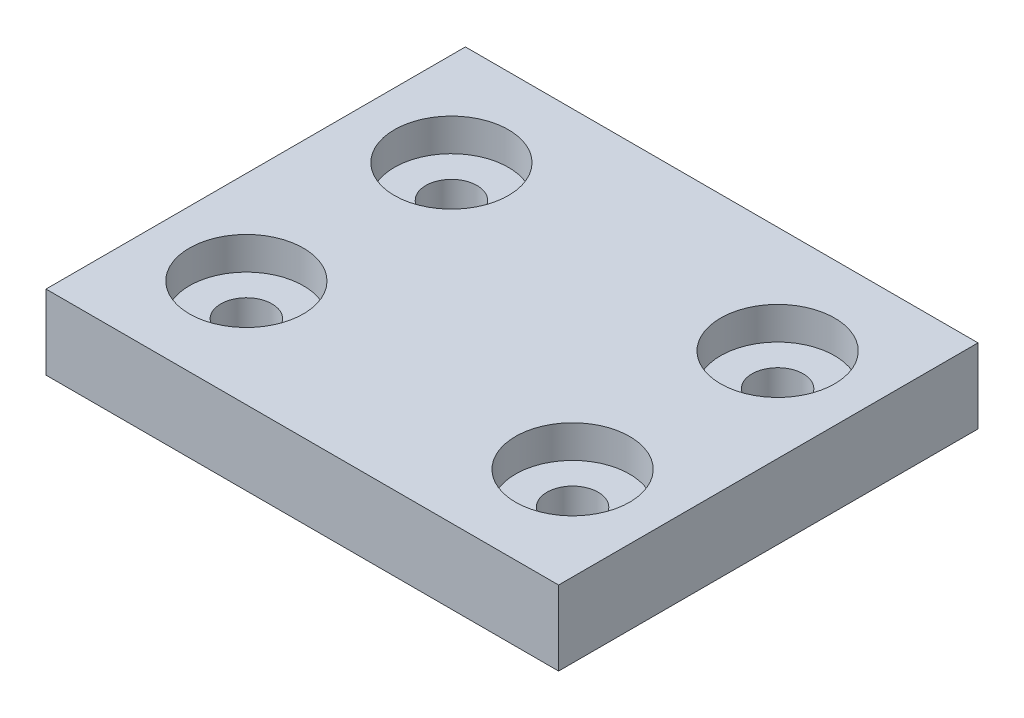
ISO-10303-21;
HEADER;
FILE_DESCRIPTION(('STEP AP214'),'2;1');
FILE_NAME('part.step','',(''),(''),'','','');
FILE_SCHEMA(('AUTOMOTIVE_DESIGN { 1 0 10303 214 1 1 1 1 }'));
ENDSEC;
DATA;
#1=APPLICATION_CONTEXT('core data for automotive mechanical design processes');
#2=APPLICATION_PROTOCOL_DEFINITION('international standard','automotive_design',2000,#1);
#3=PRODUCT_CONTEXT('',#1,'mechanical');
#4=PRODUCT('Part','Part','',(#3));
#5=PRODUCT_RELATED_PRODUCT_CATEGORY('part','',(#4));
#6=PRODUCT_DEFINITION_FORMATION('','',#4);
#7=PRODUCT_DEFINITION_CONTEXT('part definition',#1,'design');
#8=PRODUCT_DEFINITION('design','',#6,#7);
#9=PRODUCT_DEFINITION_SHAPE('','',#8);
#10=(LENGTH_UNIT() NAMED_UNIT(*) SI_UNIT(.MILLI.,.METRE.));
#11=(NAMED_UNIT(*) PLANE_ANGLE_UNIT() SI_UNIT($,.RADIAN.));
#12=(NAMED_UNIT(*) SI_UNIT($,.STERADIAN.) SOLID_ANGLE_UNIT());
#13=UNCERTAINTY_MEASURE_WITH_UNIT(LENGTH_MEASURE(1.E-05),#10,'distance_accuracy_value','');
#14=(GEOMETRIC_REPRESENTATION_CONTEXT(3) GLOBAL_UNCERTAINTY_ASSIGNED_CONTEXT((#13)) GLOBAL_UNIT_ASSIGNED_CONTEXT((#10,
#11,#12)) REPRESENTATION_CONTEXT('',''));
#15=CARTESIAN_POINT('',(0.,0.,0.));
#16=DIRECTION('',(0.,0.,1.));
#17=DIRECTION('',(1.,0.,0.));
#18=AXIS2_PLACEMENT_3D('',#15,#16,#17);
#19=CARTESIAN_POINT('',(27.5,8.,-22.5));
#20=DIRECTION('',(-1.,0.,0.));
#21=DIRECTION('',(0.,0.,1.));
#22=AXIS2_PLACEMENT_3D('',#19,#20,#21);
#23=PLANE('',#22);
#24=DIRECTION('',(0.,0.,-1.));
#25=VECTOR('',#24,1.);
#26=CARTESIAN_POINT('',(27.5,0.,-22.5));
#27=LINE('',#26,#25);
#28=CARTESIAN_POINT('',(27.5,0.,22.5));
#29=VERTEX_POINT('',#28);
#30=CARTESIAN_POINT('',(27.5,0.,-22.5));
#31=VERTEX_POINT('',#30);
#32=EDGE_CURVE('E107',#29,#31,#27,.T.);
#33=ORIENTED_EDGE('',*,*,#32,.T.);
#34=DIRECTION('',(0.,-1.,0.));
#35=VECTOR('',#34,1.);
#36=CARTESIAN_POINT('',(27.5,8.,-22.5));
#37=LINE('',#36,#35);
#38=CARTESIAN_POINT('',(27.5,8.,-22.5));
#39=VERTEX_POINT('',#38);
#40=EDGE_CURVE('E11',#39,#31,#37,.T.);
#41=ORIENTED_EDGE('',*,*,#40,.F.);
#42=DIRECTION('',(0.,0.,-1.));
#43=VECTOR('',#42,1.);
#44=CARTESIAN_POINT('',(27.5,8.,-22.5));
#45=LINE('',#44,#43);
#46=CARTESIAN_POINT('',(27.5,8.,22.5));
#47=VERTEX_POINT('',#46);
#48=EDGE_CURVE('E91',#47,#39,#45,.T.);
#49=ORIENTED_EDGE('',*,*,#48,.F.);
#50=DIRECTION('',(0.,-1.,0.));
#51=VECTOR('',#50,1.);
#52=CARTESIAN_POINT('',(27.5,8.,22.5));
#53=LINE('',#52,#51);
#54=EDGE_CURVE('E103',#47,#29,#53,.T.);
#55=ORIENTED_EDGE('',*,*,#54,.T.);
#56=EDGE_LOOP('',(#33,#41,#49,#55));
#57=FACE_BOUND('',#56,.T.);
#58=ADVANCED_FACE('F39',(#57),#23,.F.);
#59=CARTESIAN_POINT('',(-27.5,8.,-22.5));
#60=DIRECTION('',(0.,0.,1.));
#61=DIRECTION('',(1.,0.,0.));
#62=AXIS2_PLACEMENT_3D('',#59,#60,#61);
#63=PLANE('',#62);
#64=DIRECTION('',(-1.,0.,0.));
#65=VECTOR('',#64,1.);
#66=CARTESIAN_POINT('',(-27.5,0.,-22.5));
#67=LINE('',#66,#65);
#68=CARTESIAN_POINT('',(-27.5,0.,-22.5));
#69=VERTEX_POINT('',#68);
#70=EDGE_CURVE('E96',#31,#69,#67,.T.);
#71=ORIENTED_EDGE('',*,*,#70,.T.);
#72=DIRECTION('',(0.,-1.,0.));
#73=VECTOR('',#72,1.);
#74=CARTESIAN_POINT('',(-27.5,8.,-22.5));
#75=LINE('',#74,#73);
#76=CARTESIAN_POINT('',(-27.5,8.,-22.5));
#77=VERTEX_POINT('',#76);
#78=EDGE_CURVE('E48',#77,#69,#75,.T.);
#79=ORIENTED_EDGE('',*,*,#78,.F.);
#80=DIRECTION('',(-1.,0.,0.));
#81=VECTOR('',#80,1.);
#82=CARTESIAN_POINT('',(-27.5,8.,-22.5));
#83=LINE('',#82,#81);
#84=EDGE_CURVE('E86',#39,#77,#83,.T.);
#85=ORIENTED_EDGE('',*,*,#84,.F.);
#86=ORIENTED_EDGE('',*,*,#40,.T.);
#87=EDGE_LOOP('',(#71,#79,#85,#86));
#88=FACE_BOUND('',#87,.T.);
#89=ADVANCED_FACE('F95',(#88),#63,.F.);
#90=CARTESIAN_POINT('',(-27.5,8.,-22.5));
#91=DIRECTION('',(1.,0.,0.));
#92=DIRECTION('',(0.,0.,-1.));
#93=AXIS2_PLACEMENT_3D('',#90,#91,#92);
#94=PLANE('',#93);
#95=DIRECTION('',(0.,0.,1.));
#96=VECTOR('',#95,1.);
#97=CARTESIAN_POINT('',(-27.5,0.,-22.5));
#98=LINE('',#97,#96);
#99=CARTESIAN_POINT('',(-27.5,0.,22.5));
#100=VERTEX_POINT('',#99);
#101=EDGE_CURVE('E73',#69,#100,#98,.T.);
#102=ORIENTED_EDGE('',*,*,#101,.T.);
#103=DIRECTION('',(0.,-1.,0.));
#104=VECTOR('',#103,1.);
#105=CARTESIAN_POINT('',(-27.5,8.,22.5));
#106=LINE('',#105,#104);
#107=CARTESIAN_POINT('',(-27.5,8.,22.5));
#108=VERTEX_POINT('',#107);
#109=EDGE_CURVE('E98',#108,#100,#106,.T.);
#110=ORIENTED_EDGE('',*,*,#109,.F.);
#111=DIRECTION('',(0.,0.,1.));
#112=VECTOR('',#111,1.);
#113=CARTESIAN_POINT('',(-27.5,8.,-22.5));
#114=LINE('',#113,#112);
#115=EDGE_CURVE('E89',#77,#108,#114,.T.);
#116=ORIENTED_EDGE('',*,*,#115,.F.);
#117=ORIENTED_EDGE('',*,*,#78,.T.);
#118=EDGE_LOOP('',(#102,#110,#116,#117));
#119=FACE_BOUND('',#118,.T.);
#120=ADVANCED_FACE('F99',(#119),#94,.F.);
#121=CARTESIAN_POINT('',(-27.5,8.,22.5));
#122=DIRECTION('',(0.,0.,-1.));
#123=DIRECTION('',(-1.,0.,0.));
#124=AXIS2_PLACEMENT_3D('',#121,#122,#123);
#125=PLANE('',#124);
#126=DIRECTION('',(1.,0.,0.));
#127=VECTOR('',#126,1.);
#128=CARTESIAN_POINT('',(-27.5,0.,22.5));
#129=LINE('',#128,#127);
#130=EDGE_CURVE('E79',#100,#29,#129,.T.);
#131=ORIENTED_EDGE('',*,*,#130,.T.);
#132=ORIENTED_EDGE('',*,*,#54,.F.);
#133=DIRECTION('',(1.,0.,0.));
#134=VECTOR('',#133,1.);
#135=CARTESIAN_POINT('',(-27.5,8.,22.5));
#136=LINE('',#135,#134);
#137=EDGE_CURVE('E56',#108,#47,#136,.T.);
#138=ORIENTED_EDGE('',*,*,#137,.F.);
#139=ORIENTED_EDGE('',*,*,#109,.T.);
#140=EDGE_LOOP('',(#131,#132,#138,#139));
#141=FACE_BOUND('',#140,.T.);
#142=ADVANCED_FACE('F121',(#141),#125,.F.);
#143=CARTESIAN_POINT('',(0.,8.,0.));
#144=DIRECTION('',(0.,1.,0.));
#145=DIRECTION('',(0.,0.,1.));
#146=AXIS2_PLACEMENT_3D('',#143,#144,#145);
#147=PLANE('',#146);
#148=CARTESIAN_POINT('',(-17.5,8.,-11.));
#149=DIRECTION('',(0.,1.,0.));
#150=DIRECTION('',(0.,0.,1.));
#151=AXIS2_PLACEMENT_3D('',#148,#149,#150);
#152=CIRCLE('',#151,6.119);
#153=CARTESIAN_POINT('',(-17.5,8.,-4.881));
#154=VERTEX_POINT('',#153);
#155=EDGE_CURVE('E187',#154,#154,#152,.T.);
#156=ORIENTED_EDGE('',*,*,#155,.F.);
#157=EDGE_LOOP('',(#156));
#158=FACE_BOUND('',#157,.T.);
#159=CARTESIAN_POINT('',(17.5,8.,-11.));
#160=DIRECTION('',(0.,1.,0.));
#161=DIRECTION('',(0.,0.,1.));
#162=AXIS2_PLACEMENT_3D('',#159,#160,#161);
#163=CIRCLE('',#162,6.119);
#164=CARTESIAN_POINT('',(17.5,8.,-4.881));
#165=VERTEX_POINT('',#164);
#166=EDGE_CURVE('E171',#165,#165,#163,.T.);
#167=ORIENTED_EDGE('',*,*,#166,.F.);
#168=EDGE_LOOP('',(#167));
#169=FACE_BOUND('',#168,.T.);
#170=CARTESIAN_POINT('',(17.5,8.,11.));
#171=DIRECTION('',(0.,1.,0.));
#172=DIRECTION('',(0.,0.,1.));
#173=AXIS2_PLACEMENT_3D('',#170,#171,#172);
#174=CIRCLE('',#173,6.119);
#175=CARTESIAN_POINT('',(17.5,8.,17.119));
#176=VERTEX_POINT('',#175);
#177=EDGE_CURVE('E155',#176,#176,#174,.T.);
#178=ORIENTED_EDGE('',*,*,#177,.F.);
#179=EDGE_LOOP('',(#178));
#180=FACE_BOUND('',#179,.T.);
#181=CARTESIAN_POINT('',(-17.5,8.,11.));
#182=DIRECTION('',(0.,1.,0.));
#183=DIRECTION('',(0.,0.,1.));
#184=AXIS2_PLACEMENT_3D('',#181,#182,#183);
#185=CIRCLE('',#184,6.119);
#186=CARTESIAN_POINT('',(-17.5,8.,17.119));
#187=VERTEX_POINT('',#186);
#188=EDGE_CURVE('E139',#187,#187,#185,.T.);
#189=ORIENTED_EDGE('',*,*,#188,.F.);
#190=EDGE_LOOP('',(#189));
#191=FACE_BOUND('',#190,.T.);
#192=ORIENTED_EDGE('',*,*,#48,.T.);
#193=ORIENTED_EDGE('',*,*,#84,.T.);
#194=ORIENTED_EDGE('',*,*,#115,.T.);
#195=ORIENTED_EDGE('',*,*,#137,.T.);
#196=EDGE_LOOP('',(#192,#193,#194,#195));
#197=FACE_BOUND('',#196,.T.);
#198=ADVANCED_FACE('F87',(#158,#169,#180,#191,#197),#147,.T.);
#199=CARTESIAN_POINT('',(0.,0.,0.));
#200=DIRECTION('',(0.,1.,0.));
#201=DIRECTION('',(0.,0.,1.));
#202=AXIS2_PLACEMENT_3D('',#199,#200,#201);
#203=PLANE('',#202);
#204=CARTESIAN_POINT('',(-17.5,0.,-11.));
#205=DIRECTION('',(0.,1.,0.));
#206=DIRECTION('',(0.,0.,1.));
#207=AXIS2_PLACEMENT_3D('',#204,#205,#206);
#208=CIRCLE('',#207,2.75);
#209=CARTESIAN_POINT('',(-17.5,0.,-8.25));
#210=VERTEX_POINT('',#209);
#211=EDGE_CURVE('E175',#210,#210,#208,.T.);
#212=ORIENTED_EDGE('',*,*,#211,.T.);
#213=EDGE_LOOP('',(#212));
#214=FACE_BOUND('',#213,.T.);
#215=CARTESIAN_POINT('',(17.5,0.,-11.));
#216=DIRECTION('',(0.,1.,0.));
#217=DIRECTION('',(0.,0.,1.));
#218=AXIS2_PLACEMENT_3D('',#215,#216,#217);
#219=CIRCLE('',#218,2.75);
#220=CARTESIAN_POINT('',(17.5,0.,-8.25));
#221=VERTEX_POINT('',#220);
#222=EDGE_CURVE('E159',#221,#221,#219,.T.);
#223=ORIENTED_EDGE('',*,*,#222,.T.);
#224=EDGE_LOOP('',(#223));
#225=FACE_BOUND('',#224,.T.);
#226=CARTESIAN_POINT('',(17.5,0.,11.));
#227=DIRECTION('',(0.,1.,0.));
#228=DIRECTION('',(0.,0.,1.));
#229=AXIS2_PLACEMENT_3D('',#226,#227,#228);
#230=CIRCLE('',#229,2.75);
#231=CARTESIAN_POINT('',(17.5,0.,13.75));
#232=VERTEX_POINT('',#231);
#233=EDGE_CURVE('E143',#232,#232,#230,.T.);
#234=ORIENTED_EDGE('',*,*,#233,.T.);
#235=EDGE_LOOP('',(#234));
#236=FACE_BOUND('',#235,.T.);
#237=CARTESIAN_POINT('',(-17.5,0.,11.));
#238=DIRECTION('',(0.,1.,0.));
#239=DIRECTION('',(0.,0.,1.));
#240=AXIS2_PLACEMENT_3D('',#237,#238,#239);
#241=CIRCLE('',#240,2.75);
#242=CARTESIAN_POINT('',(-17.5,0.,13.75));
#243=VERTEX_POINT('',#242);
#244=EDGE_CURVE('E111',#243,#243,#241,.T.);
#245=ORIENTED_EDGE('',*,*,#244,.T.);
#246=EDGE_LOOP('',(#245));
#247=FACE_BOUND('',#246,.T.);
#248=ORIENTED_EDGE('',*,*,#32,.F.);
#249=ORIENTED_EDGE('',*,*,#130,.F.);
#250=ORIENTED_EDGE('',*,*,#101,.F.);
#251=ORIENTED_EDGE('',*,*,#70,.F.);
#252=EDGE_LOOP('',(#248,#249,#250,#251));
#253=FACE_BOUND('',#252,.T.);
#254=ADVANCED_FACE('F124',(#214,#225,#236,#247,#253),#203,.F.);
#255=CARTESIAN_POINT('',(-17.5,8.,11.));
#256=DIRECTION('',(0.,1.,0.));
#257=DIRECTION('',(0.,0.,1.));
#258=AXIS2_PLACEMENT_3D('',#255,#256,#257);
#259=CYLINDRICAL_SURFACE('',#258,2.75);
#260=ORIENTED_EDGE('',*,*,#244,.F.);
#261=EDGE_LOOP('',(#260));
#262=FACE_BOUND('',#261,.T.);
#263=CARTESIAN_POINT('',(-17.5,4.5,11.));
#264=DIRECTION('',(0.,1.,0.));
#265=DIRECTION('',(0.,0.,1.));
#266=AXIS2_PLACEMENT_3D('',#263,#264,#265);
#267=CIRCLE('',#266,2.75);
#268=CARTESIAN_POINT('',(-17.5,4.5,13.75));
#269=VERTEX_POINT('',#268);
#270=EDGE_CURVE('E131',#269,#269,#267,.T.);
#271=ORIENTED_EDGE('',*,*,#270,.T.);
#272=EDGE_LOOP('',(#271));
#273=FACE_BOUND('',#272,.T.);
#274=ADVANCED_FACE('F216',(#262,#273),#259,.F.);
#275=CARTESIAN_POINT('',(-14.75,4.5,11.));
#276=DIRECTION('',(0.,-1.,0.));
#277=DIRECTION('',(0.,0.,-1.));
#278=AXIS2_PLACEMENT_3D('',#275,#276,#277);
#279=PLANE('',#278);
#280=ORIENTED_EDGE('',*,*,#270,.F.);
#281=EDGE_LOOP('',(#280));
#282=FACE_BOUND('',#281,.T.);
#283=CARTESIAN_POINT('',(-17.5,4.5,11.));
#284=DIRECTION('',(0.,1.,0.));
#285=DIRECTION('',(0.,0.,1.));
#286=AXIS2_PLACEMENT_3D('',#283,#284,#285);
#287=CIRCLE('',#286,6.119);
#288=CARTESIAN_POINT('',(-17.5,4.5,17.119));
#289=VERTEX_POINT('',#288);
#290=EDGE_CURVE('E135',#289,#289,#287,.T.);
#291=ORIENTED_EDGE('',*,*,#290,.T.);
#292=EDGE_LOOP('',(#291));
#293=FACE_BOUND('',#292,.T.);
#294=ADVANCED_FACE('F206',(#282,#293),#279,.F.);
#295=CARTESIAN_POINT('',(-17.5,8.,11.));
#296=DIRECTION('',(0.,1.,0.));
#297=DIRECTION('',(0.,0.,1.));
#298=AXIS2_PLACEMENT_3D('',#295,#296,#297);
#299=CYLINDRICAL_SURFACE('',#298,6.119);
#300=ORIENTED_EDGE('',*,*,#290,.F.);
#301=EDGE_LOOP('',(#300));
#302=FACE_BOUND('',#301,.T.);
#303=ORIENTED_EDGE('',*,*,#188,.T.);
#304=EDGE_LOOP('',(#303));
#305=FACE_BOUND('',#304,.T.);
#306=ADVANCED_FACE('F203',(#302,#305),#299,.F.);
#307=CARTESIAN_POINT('',(17.5,8.,11.));
#308=DIRECTION('',(0.,1.,0.));
#309=DIRECTION('',(0.,0.,1.));
#310=AXIS2_PLACEMENT_3D('',#307,#308,#309);
#311=CYLINDRICAL_SURFACE('',#310,2.75);
#312=ORIENTED_EDGE('',*,*,#233,.F.);
#313=EDGE_LOOP('',(#312));
#314=FACE_BOUND('',#313,.T.);
#315=CARTESIAN_POINT('',(17.5,4.5,11.));
#316=DIRECTION('',(0.,1.,0.));
#317=DIRECTION('',(0.,0.,1.));
#318=AXIS2_PLACEMENT_3D('',#315,#316,#317);
#319=CIRCLE('',#318,2.75);
#320=CARTESIAN_POINT('',(17.5,4.5,13.75));
#321=VERTEX_POINT('',#320);
#322=EDGE_CURVE('E147',#321,#321,#319,.T.);
#323=ORIENTED_EDGE('',*,*,#322,.T.);
#324=EDGE_LOOP('',(#323));
#325=FACE_BOUND('',#324,.T.);
#326=ADVANCED_FACE('F205',(#314,#325),#311,.F.);
#327=CARTESIAN_POINT('',(20.25,4.5,11.));
#328=DIRECTION('',(0.,-1.,0.));
#329=DIRECTION('',(0.,0.,-1.));
#330=AXIS2_PLACEMENT_3D('',#327,#328,#329);
#331=PLANE('',#330);
#332=ORIENTED_EDGE('',*,*,#322,.F.);
#333=EDGE_LOOP('',(#332));
#334=FACE_BOUND('',#333,.T.);
#335=CARTESIAN_POINT('',(17.5,4.5,11.));
#336=DIRECTION('',(0.,1.,0.));
#337=DIRECTION('',(0.,0.,1.));
#338=AXIS2_PLACEMENT_3D('',#335,#336,#337);
#339=CIRCLE('',#338,6.119);
#340=CARTESIAN_POINT('',(17.5,4.5,17.119));
#341=VERTEX_POINT('',#340);
#342=EDGE_CURVE('E151',#341,#341,#339,.T.);
#343=ORIENTED_EDGE('',*,*,#342,.T.);
#344=EDGE_LOOP('',(#343));
#345=FACE_BOUND('',#344,.T.);
#346=ADVANCED_FACE('F213',(#334,#345),#331,.F.);
#347=CARTESIAN_POINT('',(17.5,8.,11.));
#348=DIRECTION('',(0.,1.,0.));
#349=DIRECTION('',(0.,0.,1.));
#350=AXIS2_PLACEMENT_3D('',#347,#348,#349);
#351=CYLINDRICAL_SURFACE('',#350,6.119);
#352=ORIENTED_EDGE('',*,*,#342,.F.);
#353=EDGE_LOOP('',(#352));
#354=FACE_BOUND('',#353,.T.);
#355=ORIENTED_EDGE('',*,*,#177,.T.);
#356=EDGE_LOOP('',(#355));
#357=FACE_BOUND('',#356,.T.);
#358=ADVANCED_FACE('F268',(#354,#357),#351,.F.);
#359=CARTESIAN_POINT('',(17.5,8.,-11.));
#360=DIRECTION('',(0.,1.,0.));
#361=DIRECTION('',(0.,0.,1.));
#362=AXIS2_PLACEMENT_3D('',#359,#360,#361);
#363=CYLINDRICAL_SURFACE('',#362,2.75);
#364=ORIENTED_EDGE('',*,*,#222,.F.);
#365=EDGE_LOOP('',(#364));
#366=FACE_BOUND('',#365,.T.);
#367=CARTESIAN_POINT('',(17.5,4.5,-11.));
#368=DIRECTION('',(0.,1.,0.));
#369=DIRECTION('',(0.,0.,1.));
#370=AXIS2_PLACEMENT_3D('',#367,#368,#369);
#371=CIRCLE('',#370,2.75);
#372=CARTESIAN_POINT('',(17.5,4.5,-8.25));
#373=VERTEX_POINT('',#372);
#374=EDGE_CURVE('E163',#373,#373,#371,.T.);
#375=ORIENTED_EDGE('',*,*,#374,.T.);
#376=EDGE_LOOP('',(#375));
#377=FACE_BOUND('',#376,.T.);
#378=ADVANCED_FACE('F278',(#366,#377),#363,.F.);
#379=CARTESIAN_POINT('',(20.25,4.5,-11.));
#380=DIRECTION('',(0.,-1.,0.));
#381=DIRECTION('',(0.,0.,-1.));
#382=AXIS2_PLACEMENT_3D('',#379,#380,#381);
#383=PLANE('',#382);
#384=ORIENTED_EDGE('',*,*,#374,.F.);
#385=EDGE_LOOP('',(#384));
#386=FACE_BOUND('',#385,.T.);
#387=CARTESIAN_POINT('',(17.5,4.5,-11.));
#388=DIRECTION('',(0.,1.,0.));
#389=DIRECTION('',(0.,0.,1.));
#390=AXIS2_PLACEMENT_3D('',#387,#388,#389);
#391=CIRCLE('',#390,6.119);
#392=CARTESIAN_POINT('',(17.5,4.5,-4.881));
#393=VERTEX_POINT('',#392);
#394=EDGE_CURVE('E167',#393,#393,#391,.T.);
#395=ORIENTED_EDGE('',*,*,#394,.T.);
#396=EDGE_LOOP('',(#395));
#397=FACE_BOUND('',#396,.T.);
#398=ADVANCED_FACE('F288',(#386,#397),#383,.F.);
#399=CARTESIAN_POINT('',(17.5,8.,-11.));
#400=DIRECTION('',(0.,1.,0.));
#401=DIRECTION('',(0.,0.,1.));
#402=AXIS2_PLACEMENT_3D('',#399,#400,#401);
#403=CYLINDRICAL_SURFACE('',#402,6.119);
#404=ORIENTED_EDGE('',*,*,#394,.F.);
#405=EDGE_LOOP('',(#404));
#406=FACE_BOUND('',#405,.T.);
#407=ORIENTED_EDGE('',*,*,#166,.T.);
#408=EDGE_LOOP('',(#407));
#409=FACE_BOUND('',#408,.T.);
#410=ADVANCED_FACE('F298',(#406,#409),#403,.F.);
#411=CARTESIAN_POINT('',(-17.5,8.,-11.));
#412=DIRECTION('',(0.,1.,0.));
#413=DIRECTION('',(0.,0.,1.));
#414=AXIS2_PLACEMENT_3D('',#411,#412,#413);
#415=CYLINDRICAL_SURFACE('',#414,2.75);
#416=ORIENTED_EDGE('',*,*,#211,.F.);
#417=EDGE_LOOP('',(#416));
#418=FACE_BOUND('',#417,.T.);
#419=CARTESIAN_POINT('',(-17.5,4.5,-11.));
#420=DIRECTION('',(0.,1.,0.));
#421=DIRECTION('',(0.,0.,1.));
#422=AXIS2_PLACEMENT_3D('',#419,#420,#421);
#423=CIRCLE('',#422,2.75);
#424=CARTESIAN_POINT('',(-17.5,4.5,-8.25));
#425=VERTEX_POINT('',#424);
#426=EDGE_CURVE('E179',#425,#425,#423,.T.);
#427=ORIENTED_EDGE('',*,*,#426,.T.);
#428=EDGE_LOOP('',(#427));
#429=FACE_BOUND('',#428,.T.);
#430=ADVANCED_FACE('F308',(#418,#429),#415,.F.);
#431=CARTESIAN_POINT('',(-14.75,4.5,-11.));
#432=DIRECTION('',(0.,-1.,0.));
#433=DIRECTION('',(0.,0.,-1.));
#434=AXIS2_PLACEMENT_3D('',#431,#432,#433);
#435=PLANE('',#434);
#436=ORIENTED_EDGE('',*,*,#426,.F.);
#437=EDGE_LOOP('',(#436));
#438=FACE_BOUND('',#437,.T.);
#439=CARTESIAN_POINT('',(-17.5,4.5,-11.));
#440=DIRECTION('',(0.,1.,0.));
#441=DIRECTION('',(0.,0.,1.));
#442=AXIS2_PLACEMENT_3D('',#439,#440,#441);
#443=CIRCLE('',#442,6.119);
#444=CARTESIAN_POINT('',(-17.5,4.5,-4.881));
#445=VERTEX_POINT('',#444);
#446=EDGE_CURVE('E183',#445,#445,#443,.T.);
#447=ORIENTED_EDGE('',*,*,#446,.T.);
#448=EDGE_LOOP('',(#447));
#449=FACE_BOUND('',#448,.T.);
#450=ADVANCED_FACE('F318',(#438,#449),#435,.F.);
#451=CARTESIAN_POINT('',(-17.5,8.,-11.));
#452=DIRECTION('',(0.,1.,0.));
#453=DIRECTION('',(0.,0.,1.));
#454=AXIS2_PLACEMENT_3D('',#451,#452,#453);
#455=CYLINDRICAL_SURFACE('',#454,6.119);
#456=ORIENTED_EDGE('',*,*,#446,.F.);
#457=EDGE_LOOP('',(#456));
#458=FACE_BOUND('',#457,.T.);
#459=ORIENTED_EDGE('',*,*,#155,.T.);
#460=EDGE_LOOP('',(#459));
#461=FACE_BOUND('',#460,.T.);
#462=ADVANCED_FACE('F192',(#458,#461),#455,.F.);
#463=CLOSED_SHELL('',(#58,#89,#120,#142,#198,#254,#274,#294,#306,#326,#346,#358,#378,#398,#410,
#430,#450,#462));
#464=MANIFOLD_SOLID_BREP('B2',#463);
#465=ADVANCED_BREP_SHAPE_REPRESENTATION('',(#18,#464),#14);
#466=SHAPE_DEFINITION_REPRESENTATION(#9,#465);
ENDSEC;
END-ISO-10303-21;
